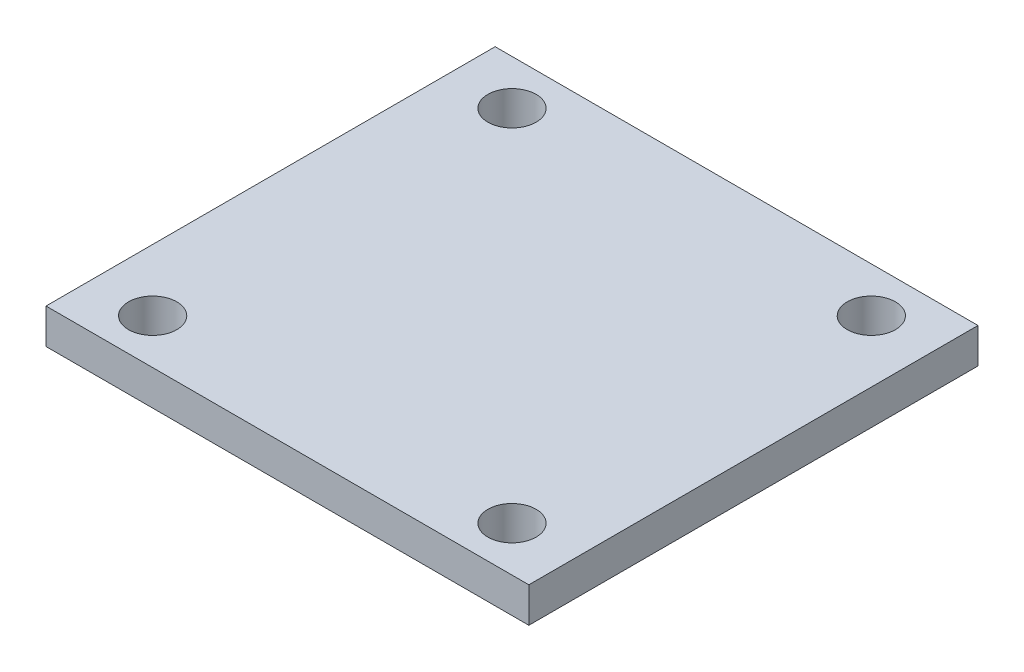
ISO-10303-21;
HEADER;
FILE_DESCRIPTION(('STEP AP214'),'2;1');
FILE_NAME('part.step','',(''),(''),'','','');
FILE_SCHEMA(('AUTOMOTIVE_DESIGN { 1 0 10303 214 1 1 1 1 }'));
ENDSEC;
DATA;
#1=APPLICATION_CONTEXT('core data for automotive mechanical design processes');
#2=APPLICATION_PROTOCOL_DEFINITION('international standard','automotive_design',2000,#1);
#3=PRODUCT_CONTEXT('',#1,'mechanical');
#4=PRODUCT('Part','Part','',(#3));
#5=PRODUCT_RELATED_PRODUCT_CATEGORY('part','',(#4));
#6=PRODUCT_DEFINITION_FORMATION('','',#4);
#7=PRODUCT_DEFINITION_CONTEXT('part definition',#1,'design');
#8=PRODUCT_DEFINITION('design','',#6,#7);
#9=PRODUCT_DEFINITION_SHAPE('','',#8);
#10=(LENGTH_UNIT() NAMED_UNIT(*) SI_UNIT(.MILLI.,.METRE.));
#11=(NAMED_UNIT(*) PLANE_ANGLE_UNIT() SI_UNIT($,.RADIAN.));
#12=(NAMED_UNIT(*) SI_UNIT($,.STERADIAN.) SOLID_ANGLE_UNIT());
#13=UNCERTAINTY_MEASURE_WITH_UNIT(LENGTH_MEASURE(1.E-05),#10,'distance_accuracy_value','');
#14=(GEOMETRIC_REPRESENTATION_CONTEXT(3) GLOBAL_UNCERTAINTY_ASSIGNED_CONTEXT((#13)) GLOBAL_UNIT_ASSIGNED_CONTEXT((#10,
#11,#12)) REPRESENTATION_CONTEXT('',''));
#15=CARTESIAN_POINT('',(0.,0.,0.));
#16=DIRECTION('',(0.,0.,1.));
#17=DIRECTION('',(1.,0.,0.));
#18=AXIS2_PLACEMENT_3D('',#15,#16,#17);
#19=CARTESIAN_POINT('',(0.,0.,0.));
#20=DIRECTION('',(0.,-1.,0.));
#21=DIRECTION('',(0.,0.,-1.));
#22=AXIS2_PLACEMENT_3D('',#19,#20,#21);
#23=PLANE('',#22);
#24=CARTESIAN_POINT('',(-16.,0.,-16.));
#25=DIRECTION('',(0.,1.,0.));
#26=DIRECTION('',(0.,0.,1.));
#27=AXIS2_PLACEMENT_3D('',#24,#25,#26);
#28=CIRCLE('',#27,2.15);
#29=CARTESIAN_POINT('',(-16.,0.,-13.85));
#30=VERTEX_POINT('',#29);
#31=EDGE_CURVE('E134',#30,#30,#28,.T.);
#32=ORIENTED_EDGE('',*,*,#31,.T.);
#33=EDGE_LOOP('',(#32));
#34=FACE_BOUND('',#33,.T.);
#35=CARTESIAN_POINT('',(16.,0.,-16.));
#36=DIRECTION('',(0.,1.,0.));
#37=DIRECTION('',(0.,0.,1.));
#38=AXIS2_PLACEMENT_3D('',#35,#36,#37);
#39=CIRCLE('',#38,2.15);
#40=CARTESIAN_POINT('',(16.,0.,-13.85));
#41=VERTEX_POINT('',#40);
#42=EDGE_CURVE('E128',#41,#41,#39,.T.);
#43=ORIENTED_EDGE('',*,*,#42,.T.);
#44=EDGE_LOOP('',(#43));
#45=FACE_BOUND('',#44,.T.);
#46=CARTESIAN_POINT('',(16.,0.,16.));
#47=DIRECTION('',(0.,1.,0.));
#48=DIRECTION('',(0.,0.,1.));
#49=AXIS2_PLACEMENT_3D('',#46,#47,#48);
#50=CIRCLE('',#49,2.15);
#51=CARTESIAN_POINT('',(16.,0.,18.15));
#52=VERTEX_POINT('',#51);
#53=EDGE_CURVE('E122',#52,#52,#50,.T.);
#54=ORIENTED_EDGE('',*,*,#53,.T.);
#55=EDGE_LOOP('',(#54));
#56=FACE_BOUND('',#55,.T.);
#57=DIRECTION('',(0.,0.,-1.));
#58=VECTOR('',#57,1.);
#59=CARTESIAN_POINT('',(21.5,0.,20.));
#60=LINE('',#59,#58);
#61=CARTESIAN_POINT('',(21.5,0.,20.));
#62=VERTEX_POINT('',#61);
#63=CARTESIAN_POINT('',(21.5,0.,-20.));
#64=VERTEX_POINT('',#63);
#65=EDGE_CURVE('E103',#62,#64,#60,.T.);
#66=ORIENTED_EDGE('',*,*,#65,.F.);
#67=DIRECTION('',(1.,0.,0.));
#68=VECTOR('',#67,1.);
#69=CARTESIAN_POINT('',(-21.5,0.,20.));
#70=LINE('',#69,#68);
#71=CARTESIAN_POINT('',(-21.5,0.,20.));
#72=VERTEX_POINT('',#71);
#73=EDGE_CURVE('E79',#72,#62,#70,.T.);
#74=ORIENTED_EDGE('',*,*,#73,.F.);
#75=DIRECTION('',(0.,0.,1.));
#76=VECTOR('',#75,1.);
#77=CARTESIAN_POINT('',(-21.5,0.,20.));
#78=LINE('',#77,#76);
#79=CARTESIAN_POINT('',(-21.5,0.,-20.));
#80=VERTEX_POINT('',#79);
#81=EDGE_CURVE('E73',#80,#72,#78,.T.);
#82=ORIENTED_EDGE('',*,*,#81,.F.);
#83=DIRECTION('',(-1.,0.,0.));
#84=VECTOR('',#83,1.);
#85=CARTESIAN_POINT('',(-21.5,0.,-20.));
#86=LINE('',#85,#84);
#87=EDGE_CURVE('E95',#64,#80,#86,.T.);
#88=ORIENTED_EDGE('',*,*,#87,.F.);
#89=EDGE_LOOP('',(#66,#74,#82,#88));
#90=FACE_BOUND('',#89,.T.);
#91=CARTESIAN_POINT('',(-16.,0.,16.));
#92=DIRECTION('',(0.,1.,0.));
#93=DIRECTION('',(0.,0.,1.));
#94=AXIS2_PLACEMENT_3D('',#91,#92,#93);
#95=CIRCLE('',#94,2.15);
#96=CARTESIAN_POINT('',(-16.,0.,18.15));
#97=VERTEX_POINT('',#96);
#98=EDGE_CURVE('E106',#97,#97,#95,.T.);
#99=ORIENTED_EDGE('',*,*,#98,.T.);
#100=EDGE_LOOP('',(#99));
#101=FACE_BOUND('',#100,.T.);
#102=ADVANCED_FACE('F39',(#34,#45,#56,#90,#101),#23,.T.);
#103=CARTESIAN_POINT('',(21.5,3.125,20.));
#104=DIRECTION('',(-1.,0.,0.));
#105=DIRECTION('',(0.,0.,1.));
#106=AXIS2_PLACEMENT_3D('',#103,#104,#105);
#107=PLANE('',#106);
#108=ORIENTED_EDGE('',*,*,#65,.T.);
#109=DIRECTION('',(0.,-1.,0.));
#110=VECTOR('',#109,1.);
#111=CARTESIAN_POINT('',(21.5,3.125,-20.));
#112=LINE('',#111,#110);
#113=CARTESIAN_POINT('',(21.5,3.125,-20.));
#114=VERTEX_POINT('',#113);
#115=EDGE_CURVE('E11',#114,#64,#112,.T.);
#116=ORIENTED_EDGE('',*,*,#115,.F.);
#117=DIRECTION('',(0.,0.,-1.));
#118=VECTOR('',#117,1.);
#119=CARTESIAN_POINT('',(21.5,3.125,20.));
#120=LINE('',#119,#118);
#121=CARTESIAN_POINT('',(21.5,3.125,20.));
#122=VERTEX_POINT('',#121);
#123=EDGE_CURVE('E91',#122,#114,#120,.T.);
#124=ORIENTED_EDGE('',*,*,#123,.F.);
#125=DIRECTION('',(0.,-1.,0.));
#126=VECTOR('',#125,1.);
#127=CARTESIAN_POINT('',(21.5,3.125,20.));
#128=LINE('',#127,#126);
#129=EDGE_CURVE('E99',#122,#62,#128,.T.);
#130=ORIENTED_EDGE('',*,*,#129,.T.);
#131=EDGE_LOOP('',(#108,#116,#124,#130));
#132=FACE_BOUND('',#131,.T.);
#133=ADVANCED_FACE('F41',(#132),#107,.F.);
#134=CARTESIAN_POINT('',(-21.5,3.125,-20.));
#135=DIRECTION('',(0.,0.,1.));
#136=DIRECTION('',(1.,0.,0.));
#137=AXIS2_PLACEMENT_3D('',#134,#135,#136);
#138=PLANE('',#137);
#139=ORIENTED_EDGE('',*,*,#87,.T.);
#140=DIRECTION('',(0.,-1.,0.));
#141=VECTOR('',#140,1.);
#142=CARTESIAN_POINT('',(-21.5,3.125,-20.));
#143=LINE('',#142,#141);
#144=CARTESIAN_POINT('',(-21.5,3.125,-20.));
#145=VERTEX_POINT('',#144);
#146=EDGE_CURVE('E48',#145,#80,#143,.T.);
#147=ORIENTED_EDGE('',*,*,#146,.F.);
#148=DIRECTION('',(-1.,0.,0.));
#149=VECTOR('',#148,1.);
#150=CARTESIAN_POINT('',(-21.5,3.125,-20.));
#151=LINE('',#150,#149);
#152=EDGE_CURVE('E86',#114,#145,#151,.T.);
#153=ORIENTED_EDGE('',*,*,#152,.F.);
#154=ORIENTED_EDGE('',*,*,#115,.T.);
#155=EDGE_LOOP('',(#139,#147,#153,#154));
#156=FACE_BOUND('',#155,.T.);
#157=ADVANCED_FACE('F94',(#156),#138,.F.);
#158=CARTESIAN_POINT('',(-21.5,3.125,20.));
#159=DIRECTION('',(1.,0.,0.));
#160=DIRECTION('',(0.,0.,-1.));
#161=AXIS2_PLACEMENT_3D('',#158,#159,#160);
#162=PLANE('',#161);
#163=ORIENTED_EDGE('',*,*,#81,.T.);
#164=DIRECTION('',(0.,-1.,0.));
#165=VECTOR('',#164,1.);
#166=CARTESIAN_POINT('',(-21.5,3.125,20.));
#167=LINE('',#166,#165);
#168=CARTESIAN_POINT('',(-21.5,3.125,20.));
#169=VERTEX_POINT('',#168);
#170=EDGE_CURVE('E96',#169,#72,#167,.T.);
#171=ORIENTED_EDGE('',*,*,#170,.F.);
#172=DIRECTION('',(0.,0.,1.));
#173=VECTOR('',#172,1.);
#174=CARTESIAN_POINT('',(-21.5,3.125,20.));
#175=LINE('',#174,#173);
#176=EDGE_CURVE('E89',#145,#169,#175,.T.);
#177=ORIENTED_EDGE('',*,*,#176,.F.);
#178=ORIENTED_EDGE('',*,*,#146,.T.);
#179=EDGE_LOOP('',(#163,#171,#177,#178));
#180=FACE_BOUND('',#179,.T.);
#181=ADVANCED_FACE('F97',(#180),#162,.F.);
#182=CARTESIAN_POINT('',(-21.5,3.125,20.));
#183=DIRECTION('',(0.,0.,-1.));
#184=DIRECTION('',(-1.,0.,0.));
#185=AXIS2_PLACEMENT_3D('',#182,#183,#184);
#186=PLANE('',#185);
#187=ORIENTED_EDGE('',*,*,#73,.T.);
#188=ORIENTED_EDGE('',*,*,#129,.F.);
#189=DIRECTION('',(1.,0.,0.));
#190=VECTOR('',#189,1.);
#191=CARTESIAN_POINT('',(-21.5,3.125,20.));
#192=LINE('',#191,#190);
#193=EDGE_CURVE('E56',#169,#122,#192,.T.);
#194=ORIENTED_EDGE('',*,*,#193,.F.);
#195=ORIENTED_EDGE('',*,*,#170,.T.);
#196=EDGE_LOOP('',(#187,#188,#194,#195));
#197=FACE_BOUND('',#196,.T.);
#198=ADVANCED_FACE('F111',(#197),#186,.F.);
#199=CARTESIAN_POINT('',(0.,3.125,0.));
#200=DIRECTION('',(0.,-1.,0.));
#201=DIRECTION('',(0.,0.,-1.));
#202=AXIS2_PLACEMENT_3D('',#199,#200,#201);
#203=PLANE('',#202);
#204=CARTESIAN_POINT('',(-16.,3.125,-16.));
#205=DIRECTION('',(0.,1.,0.));
#206=DIRECTION('',(0.,0.,1.));
#207=AXIS2_PLACEMENT_3D('',#204,#205,#206);
#208=CIRCLE('',#207,2.14999999999999);
#209=CARTESIAN_POINT('',(-16.,3.125,-13.85));
#210=VERTEX_POINT('',#209);
#211=EDGE_CURVE('E137',#210,#210,#208,.T.);
#212=ORIENTED_EDGE('',*,*,#211,.F.);
#213=EDGE_LOOP('',(#212));
#214=FACE_BOUND('',#213,.T.);
#215=CARTESIAN_POINT('',(16.,3.125,-16.));
#216=DIRECTION('',(0.,1.,0.));
#217=DIRECTION('',(0.,0.,1.));
#218=AXIS2_PLACEMENT_3D('',#215,#216,#217);
#219=CIRCLE('',#218,2.14999999999999);
#220=CARTESIAN_POINT('',(16.,3.125,-13.85));
#221=VERTEX_POINT('',#220);
#222=EDGE_CURVE('E131',#221,#221,#219,.T.);
#223=ORIENTED_EDGE('',*,*,#222,.F.);
#224=EDGE_LOOP('',(#223));
#225=FACE_BOUND('',#224,.T.);
#226=CARTESIAN_POINT('',(16.,3.125,16.));
#227=DIRECTION('',(0.,1.,0.));
#228=DIRECTION('',(0.,0.,1.));
#229=AXIS2_PLACEMENT_3D('',#226,#227,#228);
#230=CIRCLE('',#229,2.14999999999999);
#231=CARTESIAN_POINT('',(16.,3.125,18.15));
#232=VERTEX_POINT('',#231);
#233=EDGE_CURVE('E125',#232,#232,#230,.T.);
#234=ORIENTED_EDGE('',*,*,#233,.F.);
#235=EDGE_LOOP('',(#234));
#236=FACE_BOUND('',#235,.T.);
#237=CARTESIAN_POINT('',(-16.,3.125,16.));
#238=DIRECTION('',(0.,1.,0.));
#239=DIRECTION('',(0.,0.,1.));
#240=AXIS2_PLACEMENT_3D('',#237,#238,#239);
#241=CIRCLE('',#240,2.14999999999999);
#242=CARTESIAN_POINT('',(-16.,3.125,18.15));
#243=VERTEX_POINT('',#242);
#244=EDGE_CURVE('E119',#243,#243,#241,.T.);
#245=ORIENTED_EDGE('',*,*,#244,.F.);
#246=EDGE_LOOP('',(#245));
#247=FACE_BOUND('',#246,.T.);
#248=ORIENTED_EDGE('',*,*,#123,.T.);
#249=ORIENTED_EDGE('',*,*,#152,.T.);
#250=ORIENTED_EDGE('',*,*,#176,.T.);
#251=ORIENTED_EDGE('',*,*,#193,.T.);
#252=EDGE_LOOP('',(#248,#249,#250,#251));
#253=FACE_BOUND('',#252,.T.);
#254=ADVANCED_FACE('F87',(#214,#225,#236,#247,#253),#203,.F.);
#255=CARTESIAN_POINT('',(-16.,3.125,16.));
#256=DIRECTION('',(0.,1.,0.));
#257=DIRECTION('',(0.,0.,1.));
#258=AXIS2_PLACEMENT_3D('',#255,#256,#257);
#259=CYLINDRICAL_SURFACE('',#258,2.14999999999999);
#260=ORIENTED_EDGE('',*,*,#98,.F.);
#261=EDGE_LOOP('',(#260));
#262=FACE_BOUND('',#261,.T.);
#263=ORIENTED_EDGE('',*,*,#244,.T.);
#264=EDGE_LOOP('',(#263));
#265=FACE_BOUND('',#264,.T.);
#266=ADVANCED_FACE('F145',(#262,#265),#259,.F.);
#267=CARTESIAN_POINT('',(16.,3.125,16.));
#268=DIRECTION('',(0.,1.,0.));
#269=DIRECTION('',(0.,0.,1.));
#270=AXIS2_PLACEMENT_3D('',#267,#268,#269);
#271=CYLINDRICAL_SURFACE('',#270,2.14999999999999);
#272=ORIENTED_EDGE('',*,*,#53,.F.);
#273=EDGE_LOOP('',(#272));
#274=FACE_BOUND('',#273,.T.);
#275=ORIENTED_EDGE('',*,*,#233,.T.);
#276=EDGE_LOOP('',(#275));
#277=FACE_BOUND('',#276,.T.);
#278=ADVANCED_FACE('F154',(#274,#277),#271,.F.);
#279=CARTESIAN_POINT('',(16.,3.125,-16.));
#280=DIRECTION('',(0.,1.,0.));
#281=DIRECTION('',(0.,0.,1.));
#282=AXIS2_PLACEMENT_3D('',#279,#280,#281);
#283=CYLINDRICAL_SURFACE('',#282,2.14999999999999);
#284=ORIENTED_EDGE('',*,*,#42,.F.);
#285=EDGE_LOOP('',(#284));
#286=FACE_BOUND('',#285,.T.);
#287=ORIENTED_EDGE('',*,*,#222,.T.);
#288=EDGE_LOOP('',(#287));
#289=FACE_BOUND('',#288,.T.);
#290=ADVANCED_FACE('F160',(#286,#289),#283,.F.);
#291=CARTESIAN_POINT('',(-16.,3.125,-16.));
#292=DIRECTION('',(0.,1.,0.));
#293=DIRECTION('',(0.,0.,1.));
#294=AXIS2_PLACEMENT_3D('',#291,#292,#293);
#295=CYLINDRICAL_SURFACE('',#294,2.14999999999999);
#296=ORIENTED_EDGE('',*,*,#31,.F.);
#297=EDGE_LOOP('',(#296));
#298=FACE_BOUND('',#297,.T.);
#299=ORIENTED_EDGE('',*,*,#211,.T.);
#300=EDGE_LOOP('',(#299));
#301=FACE_BOUND('',#300,.T.);
#302=ADVANCED_FACE('F141',(#298,#301),#295,.F.);
#303=CLOSED_SHELL('',(#102,#133,#157,#181,#198,#254,#266,#278,#290,#302));
#304=MANIFOLD_SOLID_BREP('B2',#303);
#305=ADVANCED_BREP_SHAPE_REPRESENTATION('',(#18,#304),#14);
#306=SHAPE_DEFINITION_REPRESENTATION(#9,#305);
ENDSEC;
END-ISO-10303-21;
